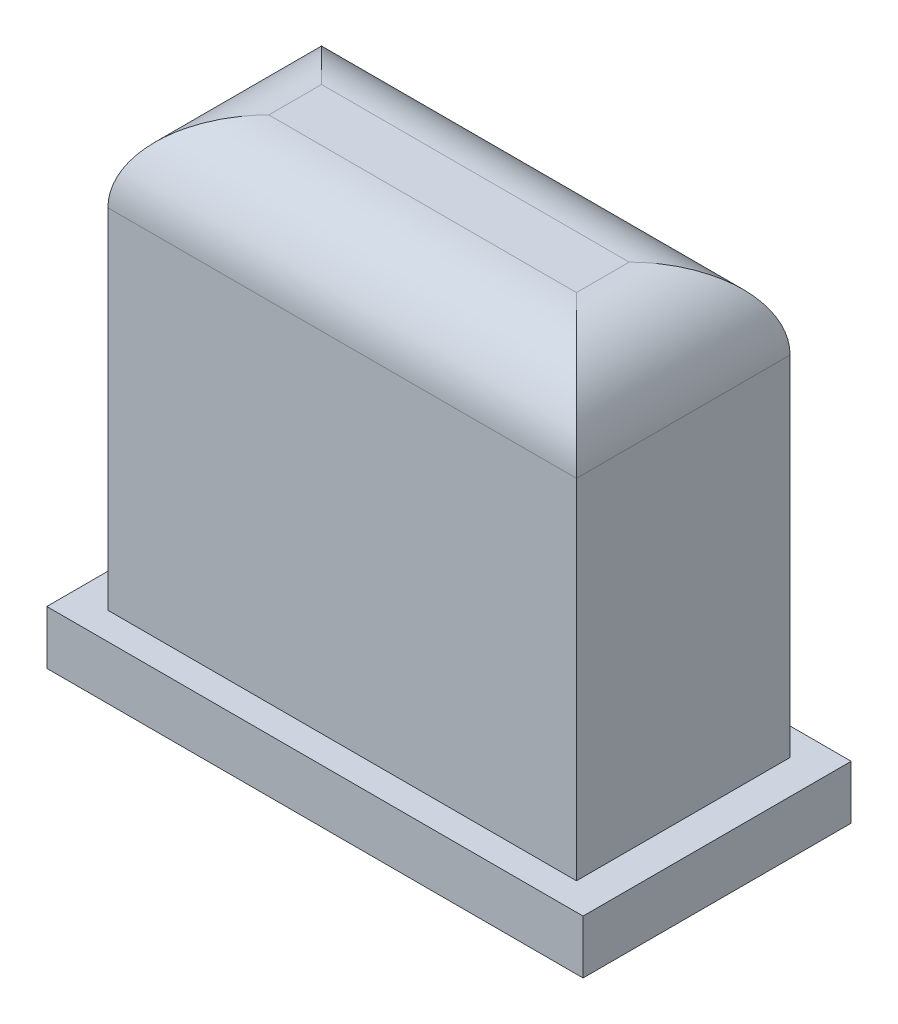
ISO-10303-21;
HEADER;
FILE_DESCRIPTION(('STEP AP214'),'2;1');
FILE_NAME('part.step','',(''),(''),'','','');
FILE_SCHEMA(('AUTOMOTIVE_DESIGN { 1 0 10303 214 1 1 1 1 }'));
ENDSEC;
DATA;
#1=APPLICATION_CONTEXT('core data for automotive mechanical design processes');
#2=APPLICATION_PROTOCOL_DEFINITION('international standard','automotive_design',2000,#1);
#3=PRODUCT_CONTEXT('',#1,'mechanical');
#4=PRODUCT('Part','Part','',(#3));
#5=PRODUCT_RELATED_PRODUCT_CATEGORY('part','',(#4));
#6=PRODUCT_DEFINITION_FORMATION('','',#4);
#7=PRODUCT_DEFINITION_CONTEXT('part definition',#1,'design');
#8=PRODUCT_DEFINITION('design','',#6,#7);
#9=PRODUCT_DEFINITION_SHAPE('','',#8);
#10=(LENGTH_UNIT() NAMED_UNIT(*) SI_UNIT(.MILLI.,.METRE.));
#11=(NAMED_UNIT(*) PLANE_ANGLE_UNIT() SI_UNIT($,.RADIAN.));
#12=(NAMED_UNIT(*) SI_UNIT($,.STERADIAN.) SOLID_ANGLE_UNIT());
#13=UNCERTAINTY_MEASURE_WITH_UNIT(LENGTH_MEASURE(1.E-05),#10,'distance_accuracy_value','');
#14=(GEOMETRIC_REPRESENTATION_CONTEXT(3) GLOBAL_UNCERTAINTY_ASSIGNED_CONTEXT((#13)) GLOBAL_UNIT_ASSIGNED_CONTEXT((#10,
#11,#12)) REPRESENTATION_CONTEXT('',''));
#15=CARTESIAN_POINT('',(0.,0.,0.));
#16=DIRECTION('',(0.,0.,1.));
#17=DIRECTION('',(1.,0.,0.));
#18=AXIS2_PLACEMENT_3D('',#15,#16,#17);
#19=CARTESIAN_POINT('',(0.,10.,0.));
#20=DIRECTION('',(0.,-1.,0.));
#21=DIRECTION('',(0.,0.,-1.));
#22=AXIS2_PLACEMENT_3D('',#19,#20,#21);
#23=PLANE('',#22);
#24=DIRECTION('',(0.,0.,-1.));
#25=VECTOR('',#24,1.);
#26=CARTESIAN_POINT('',(50.,10.,25.));
#27=LINE('',#26,#25);
#28=CARTESIAN_POINT('',(50.,10.,25.));
#29=VERTEX_POINT('',#28);
#30=CARTESIAN_POINT('',(50.,10.,-25.));
#31=VERTEX_POINT('',#30);
#32=EDGE_CURVE('E144',#29,#31,#27,.T.);
#33=ORIENTED_EDGE('',*,*,#32,.T.);
#34=DIRECTION('',(-1.,0.,0.));
#35=VECTOR('',#34,1.);
#36=CARTESIAN_POINT('',(-50.,10.,-25.));
#37=LINE('',#36,#35);
#38=CARTESIAN_POINT('',(-50.,10.,-25.));
#39=VERTEX_POINT('',#38);
#40=EDGE_CURVE('E147',#31,#39,#37,.T.);
#41=ORIENTED_EDGE('',*,*,#40,.T.);
#42=DIRECTION('',(0.,0.,1.));
#43=VECTOR('',#42,1.);
#44=CARTESIAN_POINT('',(-50.,10.,25.));
#45=LINE('',#44,#43);
#46=CARTESIAN_POINT('',(-50.,10.,25.));
#47=VERTEX_POINT('',#46);
#48=EDGE_CURVE('E150',#39,#47,#45,.T.);
#49=ORIENTED_EDGE('',*,*,#48,.T.);
#50=DIRECTION('',(1.,0.,0.));
#51=VECTOR('',#50,1.);
#52=CARTESIAN_POINT('',(-50.,10.,25.));
#53=LINE('',#52,#51);
#54=EDGE_CURVE('E152',#47,#29,#53,.T.);
#55=ORIENTED_EDGE('',*,*,#54,.T.);
#56=EDGE_LOOP('',(#33,#41,#49,#55));
#57=FACE_BOUND('',#56,.T.);
#58=DIRECTION('',(0.,0.,1.));
#59=VECTOR('',#58,1.);
#60=CARTESIAN_POINT('',(-43.6901872313672,10.,19.9187908015427));
#61=LINE('',#60,#59);
#62=CARTESIAN_POINT('',(-43.6901872313672,10.,-19.9187908015427));
#63=VERTEX_POINT('',#62);
#64=CARTESIAN_POINT('',(-43.6901872313672,10.,19.9187908015427));
#65=VERTEX_POINT('',#64);
#66=EDGE_CURVE('E117',#63,#65,#61,.T.);
#67=ORIENTED_EDGE('',*,*,#66,.F.);
#68=DIRECTION('',(-1.,0.,0.));
#69=VECTOR('',#68,1.);
#70=CARTESIAN_POINT('',(43.6901872313672,10.,-19.9187908015427));
#71=LINE('',#70,#69);
#72=CARTESIAN_POINT('',(43.6901872313672,10.,-19.9187908015427));
#73=VERTEX_POINT('',#72);
#74=EDGE_CURVE('E122',#73,#63,#71,.T.);
#75=ORIENTED_EDGE('',*,*,#74,.F.);
#76=DIRECTION('',(0.,0.,-1.));
#77=VECTOR('',#76,1.);
#78=CARTESIAN_POINT('',(43.6901872313672,10.,19.9187908015427));
#79=LINE('',#78,#77);
#80=CARTESIAN_POINT('',(43.6901872313672,10.,19.9187908015427));
#81=VERTEX_POINT('',#80);
#82=EDGE_CURVE('E133',#81,#73,#79,.T.);
#83=ORIENTED_EDGE('',*,*,#82,.F.);
#84=DIRECTION('',(1.,0.,0.));
#85=VECTOR('',#84,1.);
#86=CARTESIAN_POINT('',(43.6901872313672,10.,19.9187908015427));
#87=LINE('',#86,#85);
#88=EDGE_CURVE('E130',#65,#81,#87,.T.);
#89=ORIENTED_EDGE('',*,*,#88,.F.);
#90=EDGE_LOOP('',(#67,#75,#83,#89));
#91=FACE_BOUND('',#90,.T.);
#92=ADVANCED_FACE('F35',(#57,#91),#23,.F.);
#93=CARTESIAN_POINT('',(50.,10.,25.));
#94=DIRECTION('',(-1.,0.,0.));
#95=DIRECTION('',(0.,0.,1.));
#96=AXIS2_PLACEMENT_3D('',#93,#94,#95);
#97=PLANE('',#96);
#98=DIRECTION('',(0.,0.,-1.));
#99=VECTOR('',#98,1.);
#100=CARTESIAN_POINT('',(50.,0.,25.));
#101=LINE('',#100,#99);
#102=CARTESIAN_POINT('',(50.,0.,25.));
#103=VERTEX_POINT('',#102);
#104=CARTESIAN_POINT('',(50.,0.,-25.));
#105=VERTEX_POINT('',#104);
#106=EDGE_CURVE('E143',#103,#105,#101,.T.);
#107=ORIENTED_EDGE('',*,*,#106,.T.);
#108=DIRECTION('',(0.,-1.,0.));
#109=VECTOR('',#108,1.);
#110=CARTESIAN_POINT('',(50.,10.,-25.));
#111=LINE('',#110,#109);
#112=EDGE_CURVE('E170',#31,#105,#111,.T.);
#113=ORIENTED_EDGE('',*,*,#112,.F.);
#114=ORIENTED_EDGE('',*,*,#32,.F.);
#115=DIRECTION('',(0.,-1.,0.));
#116=VECTOR('',#115,1.);
#117=CARTESIAN_POINT('',(50.,10.,25.));
#118=LINE('',#117,#116);
#119=EDGE_CURVE('E154',#29,#103,#118,.T.);
#120=ORIENTED_EDGE('',*,*,#119,.T.);
#121=EDGE_LOOP('',(#107,#113,#114,#120));
#122=FACE_BOUND('',#121,.T.);
#123=ADVANCED_FACE('F222',(#122),#97,.F.);
#124=CARTESIAN_POINT('',(-50.,10.,-25.));
#125=DIRECTION('',(0.,0.,1.));
#126=DIRECTION('',(1.,0.,0.));
#127=AXIS2_PLACEMENT_3D('',#124,#125,#126);
#128=PLANE('',#127);
#129=DIRECTION('',(-1.,0.,0.));
#130=VECTOR('',#129,1.);
#131=CARTESIAN_POINT('',(-50.,0.,-25.));
#132=LINE('',#131,#130);
#133=CARTESIAN_POINT('',(-50.,0.,-25.));
#134=VERTEX_POINT('',#133);
#135=EDGE_CURVE('E157',#105,#134,#132,.T.);
#136=ORIENTED_EDGE('',*,*,#135,.T.);
#137=DIRECTION('',(0.,-1.,0.));
#138=VECTOR('',#137,1.);
#139=CARTESIAN_POINT('',(-50.,10.,-25.));
#140=LINE('',#139,#138);
#141=EDGE_CURVE('E167',#39,#134,#140,.T.);
#142=ORIENTED_EDGE('',*,*,#141,.F.);
#143=ORIENTED_EDGE('',*,*,#40,.F.);
#144=ORIENTED_EDGE('',*,*,#112,.T.);
#145=EDGE_LOOP('',(#136,#142,#143,#144));
#146=FACE_BOUND('',#145,.T.);
#147=ADVANCED_FACE('F228',(#146),#128,.F.);
#148=CARTESIAN_POINT('',(-50.,10.,25.));
#149=DIRECTION('',(1.,0.,0.));
#150=DIRECTION('',(0.,0.,-1.));
#151=AXIS2_PLACEMENT_3D('',#148,#149,#150);
#152=PLANE('',#151);
#153=DIRECTION('',(0.,0.,1.));
#154=VECTOR('',#153,1.);
#155=CARTESIAN_POINT('',(-50.,0.,25.));
#156=LINE('',#155,#154);
#157=CARTESIAN_POINT('',(-50.,0.,25.));
#158=VERTEX_POINT('',#157);
#159=EDGE_CURVE('E159',#134,#158,#156,.T.);
#160=ORIENTED_EDGE('',*,*,#159,.T.);
#161=DIRECTION('',(0.,-1.,0.));
#162=VECTOR('',#161,1.);
#163=CARTESIAN_POINT('',(-50.,10.,25.));
#164=LINE('',#163,#162);
#165=EDGE_CURVE('E164',#47,#158,#164,.T.);
#166=ORIENTED_EDGE('',*,*,#165,.F.);
#167=ORIENTED_EDGE('',*,*,#48,.F.);
#168=ORIENTED_EDGE('',*,*,#141,.T.);
#169=EDGE_LOOP('',(#160,#166,#167,#168));
#170=FACE_BOUND('',#169,.T.);
#171=ADVANCED_FACE('F241',(#170),#152,.F.);
#172=CARTESIAN_POINT('',(-50.,10.,25.));
#173=DIRECTION('',(0.,0.,-1.));
#174=DIRECTION('',(-1.,0.,0.));
#175=AXIS2_PLACEMENT_3D('',#172,#173,#174);
#176=PLANE('',#175);
#177=DIRECTION('',(1.,0.,0.));
#178=VECTOR('',#177,1.);
#179=CARTESIAN_POINT('',(-50.,0.,25.));
#180=LINE('',#179,#178);
#181=EDGE_CURVE('E148',#158,#103,#180,.T.);
#182=ORIENTED_EDGE('',*,*,#181,.T.);
#183=ORIENTED_EDGE('',*,*,#119,.F.);
#184=ORIENTED_EDGE('',*,*,#54,.F.);
#185=ORIENTED_EDGE('',*,*,#165,.T.);
#186=EDGE_LOOP('',(#182,#183,#184,#185));
#187=FACE_BOUND('',#186,.T.);
#188=ADVANCED_FACE('F237',(#187),#176,.F.);
#189=CARTESIAN_POINT('',(0.,0.,0.));
#190=DIRECTION('',(0.,-1.,0.));
#191=DIRECTION('',(0.,0.,-1.));
#192=AXIS2_PLACEMENT_3D('',#189,#190,#191);
#193=PLANE('',#192);
#194=CARTESIAN_POINT('',(0.,0.,0.));
#195=DIRECTION('',(0.,-1.,0.));
#196=DIRECTION('',(0.,0.,-1.));
#197=AXIS2_PLACEMENT_3D('',#194,#195,#196);
#198=CIRCLE('',#197,6.08239751934734);
#199=CARTESIAN_POINT('',(0.,0.,-6.08239751934734));
#200=VERTEX_POINT('',#199);
#201=EDGE_CURVE('E380',#200,#200,#198,.T.);
#202=ORIENTED_EDGE('',*,*,#201,.F.);
#203=EDGE_LOOP('',(#202));
#204=FACE_BOUND('',#203,.T.);
#205=ORIENTED_EDGE('',*,*,#106,.F.);
#206=ORIENTED_EDGE('',*,*,#181,.F.);
#207=ORIENTED_EDGE('',*,*,#159,.F.);
#208=ORIENTED_EDGE('',*,*,#135,.F.);
#209=EDGE_LOOP('',(#205,#206,#207,#208));
#210=FACE_BOUND('',#209,.T.);
#211=ADVANCED_FACE('F234',(#204,#210),#193,.T.);
#212=CARTESIAN_POINT('',(-43.6901872313672,90.,19.9187908015427));
#213=DIRECTION('',(1.,0.,0.));
#214=DIRECTION('',(0.,0.,-1.));
#215=AXIS2_PLACEMENT_3D('',#212,#213,#214);
#216=PLANE('',#215);
#217=DIRECTION('',(0.,-1.,0.));
#218=VECTOR('',#217,1.);
#219=CARTESIAN_POINT('',(-43.6901872313672,90.,19.9187908015427));
#220=LINE('',#219,#218);
#221=CARTESIAN_POINT('',(-43.6901872313672,75.,19.9187908015427));
#222=VERTEX_POINT('',#221);
#223=EDGE_CURVE('E141',#222,#65,#220,.T.);
#224=ORIENTED_EDGE('',*,*,#223,.F.);
#225=DIRECTION('',(0.,0.,1.));
#226=VECTOR('',#225,1.);
#227=CARTESIAN_POINT('',(-43.6901872313672,75.,-19.9187908015427));
#228=LINE('',#227,#226);
#229=CARTESIAN_POINT('',(-43.6901872313672,75.,-19.9187908015427));
#230=VERTEX_POINT('',#229);
#231=EDGE_CURVE('E119',#222,#230,#228,.F.);
#232=ORIENTED_EDGE('',*,*,#231,.T.);
#233=DIRECTION('',(0.,-1.,0.));
#234=VECTOR('',#233,1.);
#235=CARTESIAN_POINT('',(-43.6901872313672,90.,-19.9187908015427));
#236=LINE('',#235,#234);
#237=EDGE_CURVE('E113',#230,#63,#236,.T.);
#238=ORIENTED_EDGE('',*,*,#237,.T.);
#239=ORIENTED_EDGE('',*,*,#66,.T.);
#240=EDGE_LOOP('',(#224,#232,#238,#239));
#241=FACE_BOUND('',#240,.T.);
#242=ADVANCED_FACE('F116',(#241),#216,.F.);
#243=CARTESIAN_POINT('',(43.6901872313672,90.,19.9187908015427));
#244=DIRECTION('',(0.,0.,-1.));
#245=DIRECTION('',(-1.,0.,0.));
#246=AXIS2_PLACEMENT_3D('',#243,#244,#245);
#247=PLANE('',#246);
#248=DIRECTION('',(0.,-1.,0.));
#249=VECTOR('',#248,1.);
#250=CARTESIAN_POINT('',(43.6901872313672,90.,19.9187908015427));
#251=LINE('',#250,#249);
#252=CARTESIAN_POINT('',(43.6901872313672,75.,19.9187908015427));
#253=VERTEX_POINT('',#252);
#254=EDGE_CURVE('E139',#253,#81,#251,.T.);
#255=ORIENTED_EDGE('',*,*,#254,.F.);
#256=DIRECTION('',(1.,0.,0.));
#257=VECTOR('',#256,1.);
#258=CARTESIAN_POINT('',(-43.6901872313672,75.,19.9187908015427));
#259=LINE('',#258,#257);
#260=EDGE_CURVE('E11',#253,#222,#259,.F.);
#261=ORIENTED_EDGE('',*,*,#260,.T.);
#262=ORIENTED_EDGE('',*,*,#223,.T.);
#263=ORIENTED_EDGE('',*,*,#88,.T.);
#264=EDGE_LOOP('',(#255,#261,#262,#263));
#265=FACE_BOUND('',#264,.T.);
#266=ADVANCED_FACE('F206',(#265),#247,.F.);
#267=CARTESIAN_POINT('',(43.6901872313672,90.,19.9187908015427));
#268=DIRECTION('',(-1.,0.,0.));
#269=DIRECTION('',(0.,0.,1.));
#270=AXIS2_PLACEMENT_3D('',#267,#268,#269);
#271=PLANE('',#270);
#272=DIRECTION('',(0.,-1.,0.));
#273=VECTOR('',#272,1.);
#274=CARTESIAN_POINT('',(43.6901872313672,90.,-19.9187908015427));
#275=LINE('',#274,#273);
#276=CARTESIAN_POINT('',(43.6901872313672,75.,-19.9187908015427));
#277=VERTEX_POINT('',#276);
#278=EDGE_CURVE('E121',#277,#73,#275,.T.);
#279=ORIENTED_EDGE('',*,*,#278,.F.);
#280=DIRECTION('',(0.,0.,-1.));
#281=VECTOR('',#280,1.);
#282=CARTESIAN_POINT('',(43.6901872313672,75.,19.9187908015427));
#283=LINE('',#282,#281);
#284=EDGE_CURVE('E44',#277,#253,#283,.F.);
#285=ORIENTED_EDGE('',*,*,#284,.T.);
#286=ORIENTED_EDGE('',*,*,#254,.T.);
#287=ORIENTED_EDGE('',*,*,#82,.T.);
#288=EDGE_LOOP('',(#279,#285,#286,#287));
#289=FACE_BOUND('',#288,.T.);
#290=ADVANCED_FACE('F218',(#289),#271,.F.);
#291=CARTESIAN_POINT('',(43.6901872313672,90.,-19.9187908015427));
#292=DIRECTION('',(0.,0.,1.));
#293=DIRECTION('',(1.,0.,0.));
#294=AXIS2_PLACEMENT_3D('',#291,#292,#293);
#295=PLANE('',#294);
#296=ORIENTED_EDGE('',*,*,#237,.F.);
#297=DIRECTION('',(-1.,0.,0.));
#298=VECTOR('',#297,1.);
#299=CARTESIAN_POINT('',(43.6901872313672,75.,-19.9187908015427));
#300=LINE('',#299,#298);
#301=EDGE_CURVE('E59',#230,#277,#300,.F.);
#302=ORIENTED_EDGE('',*,*,#301,.T.);
#303=ORIENTED_EDGE('',*,*,#278,.T.);
#304=ORIENTED_EDGE('',*,*,#74,.T.);
#305=EDGE_LOOP('',(#296,#302,#303,#304));
#306=FACE_BOUND('',#305,.T.);
#307=ADVANCED_FACE('F132',(#306),#295,.F.);
#308=CARTESIAN_POINT('',(0.,90.,0.));
#309=DIRECTION('',(0.,1.,0.));
#310=DIRECTION('',(0.,0.,1.));
#311=AXIS2_PLACEMENT_3D('',#308,#309,#310);
#312=PLANE('',#311);
#313=DIRECTION('',(-1.,0.,0.));
#314=VECTOR('',#313,1.);
#315=CARTESIAN_POINT('',(-43.6901872313672,90.,-4.9187908015427));
#316=LINE('',#315,#314);
#317=CARTESIAN_POINT('',(28.6901872313673,90.,-4.9187908015427));
#318=VERTEX_POINT('',#317);
#319=CARTESIAN_POINT('',(-28.6901872313673,90.,-4.9187908015427));
#320=VERTEX_POINT('',#319);
#321=EDGE_CURVE('E177',#318,#320,#316,.T.);
#322=ORIENTED_EDGE('',*,*,#321,.T.);
#323=DIRECTION('',(0.,0.,1.));
#324=VECTOR('',#323,1.);
#325=CARTESIAN_POINT('',(-28.6901872313673,90.,19.9187908015427));
#326=LINE('',#325,#324);
#327=CARTESIAN_POINT('',(-28.6901872313673,90.,4.9187908015427));
#328=VERTEX_POINT('',#327);
#329=EDGE_CURVE('E179',#320,#328,#326,.T.);
#330=ORIENTED_EDGE('',*,*,#329,.T.);
#331=DIRECTION('',(1.,0.,0.));
#332=VECTOR('',#331,1.);
#333=CARTESIAN_POINT('',(43.6901872313672,90.,4.9187908015427));
#334=LINE('',#333,#332);
#335=CARTESIAN_POINT('',(28.6901872313673,90.,4.9187908015427));
#336=VERTEX_POINT('',#335);
#337=EDGE_CURVE('E173',#328,#336,#334,.T.);
#338=ORIENTED_EDGE('',*,*,#337,.T.);
#339=DIRECTION('',(0.,0.,-1.));
#340=VECTOR('',#339,1.);
#341=CARTESIAN_POINT('',(28.6901872313673,90.,-19.9187908015427));
#342=LINE('',#341,#340);
#343=EDGE_CURVE('E175',#336,#318,#342,.T.);
#344=ORIENTED_EDGE('',*,*,#343,.T.);
#345=EDGE_LOOP('',(#322,#330,#338,#344));
#346=FACE_BOUND('',#345,.T.);
#347=ADVANCED_FACE('F211',(#346),#312,.T.);
#348=CARTESIAN_POINT('',(28.6901872313673,75.,0.));
#349=DIRECTION('',(0.,0.,1.));
#350=DIRECTION('',(1.,0.,0.));
#351=AXIS2_PLACEMENT_3D('',#348,#349,#350);
#352=CYLINDRICAL_SURFACE('',#351,15.);
#353=CARTESIAN_POINT('',(28.6901872313673,75.,4.9187908015427));
#354=DIRECTION('',(-0.707106781186547,0.,0.707106781186547));
#355=DIRECTION('',(-0.707106781186547,0.,-0.707106781186547));
#356=AXIS2_PLACEMENT_3D('',#353,#354,#355);
#357=ELLIPSE('',#356,21.2132034355964,15.);
#358=EDGE_CURVE('E189',#253,#336,#357,.T.);
#359=ORIENTED_EDGE('',*,*,#358,.F.);
#360=ORIENTED_EDGE('',*,*,#284,.F.);
#361=CARTESIAN_POINT('',(28.6901872313673,75.,-4.9187908015427));
#362=DIRECTION('',(0.707106781186547,0.,0.707106781186547));
#363=DIRECTION('',(-0.707106781186547,0.,0.707106781186547));
#364=AXIS2_PLACEMENT_3D('',#361,#362,#363);
#365=ELLIPSE('',#364,21.2132034355964,15.);
#366=EDGE_CURVE('E39',#318,#277,#365,.F.);
#367=ORIENTED_EDGE('',*,*,#366,.F.);
#368=ORIENTED_EDGE('',*,*,#343,.F.);
#369=EDGE_LOOP('',(#359,#360,#367,#368));
#370=FACE_BOUND('',#369,.T.);
#371=ADVANCED_FACE('F37',(#370),#352,.T.);
#372=CARTESIAN_POINT('',(0.,75.,-4.9187908015427));
#373=DIRECTION('',(1.,0.,0.));
#374=DIRECTION('',(0.,0.,-1.));
#375=AXIS2_PLACEMENT_3D('',#372,#373,#374);
#376=CYLINDRICAL_SURFACE('',#375,15.);
#377=ORIENTED_EDGE('',*,*,#366,.T.);
#378=ORIENTED_EDGE('',*,*,#301,.F.);
#379=CARTESIAN_POINT('',(-28.6901872313673,75.,-4.9187908015427));
#380=DIRECTION('',(0.707106781186547,0.,-0.707106781186547));
#381=DIRECTION('',(0.707106781186547,0.,0.707106781186547));
#382=AXIS2_PLACEMENT_3D('',#379,#380,#381);
#383=ELLIPSE('',#382,21.2132034355964,15.);
#384=EDGE_CURVE('E187',#320,#230,#383,.F.);
#385=ORIENTED_EDGE('',*,*,#384,.F.);
#386=ORIENTED_EDGE('',*,*,#321,.F.);
#387=EDGE_LOOP('',(#377,#378,#385,#386));
#388=FACE_BOUND('',#387,.T.);
#389=ADVANCED_FACE('F199',(#388),#376,.T.);
#390=CARTESIAN_POINT('',(0.,75.,4.9187908015427));
#391=DIRECTION('',(-1.,0.,0.));
#392=DIRECTION('',(0.,0.,1.));
#393=AXIS2_PLACEMENT_3D('',#390,#391,#392);
#394=CYLINDRICAL_SURFACE('',#393,15.);
#395=ORIENTED_EDGE('',*,*,#358,.T.);
#396=ORIENTED_EDGE('',*,*,#337,.F.);
#397=CARTESIAN_POINT('',(-28.6901872313673,75.,4.9187908015427));
#398=DIRECTION('',(-0.707106781186547,0.,-0.707106781186547));
#399=DIRECTION('',(-0.707106781186547,0.,0.707106781186547));
#400=AXIS2_PLACEMENT_3D('',#397,#398,#399);
#401=ELLIPSE('',#400,21.2132034355964,15.);
#402=EDGE_CURVE('E185',#222,#328,#401,.T.);
#403=ORIENTED_EDGE('',*,*,#402,.F.);
#404=ORIENTED_EDGE('',*,*,#260,.F.);
#405=EDGE_LOOP('',(#395,#396,#403,#404));
#406=FACE_BOUND('',#405,.T.);
#407=ADVANCED_FACE('F204',(#406),#394,.T.);
#408=CARTESIAN_POINT('',(-28.6901872313673,75.,0.));
#409=DIRECTION('',(0.,0.,-1.));
#410=DIRECTION('',(-1.,0.,0.));
#411=AXIS2_PLACEMENT_3D('',#408,#409,#410);
#412=CYLINDRICAL_SURFACE('',#411,15.);
#413=ORIENTED_EDGE('',*,*,#384,.T.);
#414=ORIENTED_EDGE('',*,*,#231,.F.);
#415=ORIENTED_EDGE('',*,*,#402,.T.);
#416=ORIENTED_EDGE('',*,*,#329,.F.);
#417=EDGE_LOOP('',(#413,#414,#415,#416));
#418=FACE_BOUND('',#417,.T.);
#419=ADVANCED_FACE('F208',(#418),#412,.T.);
#420=CARTESIAN_POINT('',(0.,-10.,0.));
#421=DIRECTION('',(0.,1.,0.));
#422=DIRECTION('',(0.,0.,1.));
#423=AXIS2_PLACEMENT_3D('',#420,#421,#422);
#424=CYLINDRICAL_SURFACE('',#423,6.08239751934734);
#425=CARTESIAN_POINT('',(0.,-10.,0.));
#426=DIRECTION('',(0.,-1.,0.));
#427=DIRECTION('',(0.,0.,-1.));
#428=AXIS2_PLACEMENT_3D('',#425,#426,#427);
#429=CIRCLE('',#428,6.08239751934734);
#430=CARTESIAN_POINT('',(0.,-10.,-6.08239751934734));
#431=VERTEX_POINT('',#430);
#432=EDGE_CURVE('E188',#431,#431,#429,.T.);
#433=ORIENTED_EDGE('',*,*,#432,.F.);
#434=EDGE_LOOP('',(#433));
#435=FACE_BOUND('',#434,.T.);
#436=ORIENTED_EDGE('',*,*,#201,.T.);
#437=EDGE_LOOP('',(#436));
#438=FACE_BOUND('',#437,.T.);
#439=ADVANCED_FACE('F251',(#435,#438),#424,.T.);
#440=CARTESIAN_POINT('',(0.,-10.,0.));
#441=DIRECTION('',(0.,-1.,0.));
#442=DIRECTION('',(0.,0.,-1.));
#443=AXIS2_PLACEMENT_3D('',#440,#441,#442);
#444=PLANE('',#443);
#445=ORIENTED_EDGE('',*,*,#432,.T.);
#446=EDGE_LOOP('',(#445));
#447=FACE_BOUND('',#446,.T.);
#448=ADVANCED_FACE('F272',(#447),#444,.T.);
#449=CLOSED_SHELL('',(#92,#123,#147,#171,#188,#211,#242,#266,#290,#307,#347,#371,#389,#407,#419,
#439,#448));
#450=MANIFOLD_SOLID_BREP('B2',#449);
#451=ADVANCED_BREP_SHAPE_REPRESENTATION('',(#18,#450),#14);
#452=SHAPE_DEFINITION_REPRESENTATION(#9,#451);
ENDSEC;
END-ISO-10303-21;
